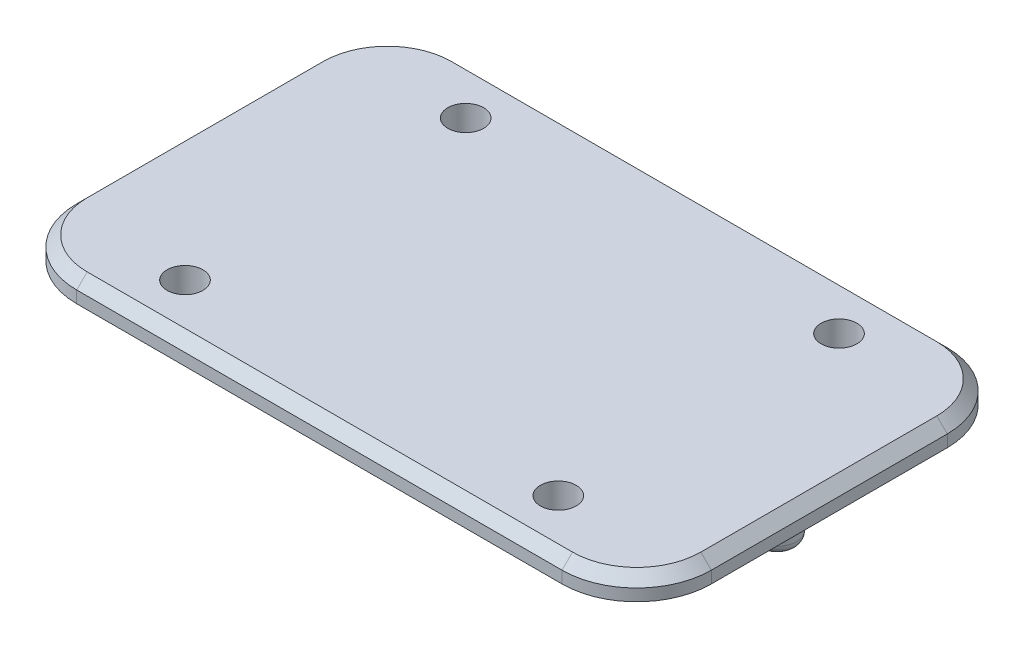
ISO-10303-21;
HEADER;
FILE_DESCRIPTION(('STEP AP214'),'2;1');
FILE_NAME('part.step','',(''),(''),'','','');
FILE_SCHEMA(('AUTOMOTIVE_DESIGN { 1 0 10303 214 1 1 1 1 }'));
ENDSEC;
DATA;
#1=APPLICATION_CONTEXT('core data for automotive mechanical design processes');
#2=APPLICATION_PROTOCOL_DEFINITION('international standard','automotive_design',2000,#1);
#3=PRODUCT_CONTEXT('',#1,'mechanical');
#4=PRODUCT('Part','Part','',(#3));
#5=PRODUCT_RELATED_PRODUCT_CATEGORY('part','',(#4));
#6=PRODUCT_DEFINITION_FORMATION('','',#4);
#7=PRODUCT_DEFINITION_CONTEXT('part definition',#1,'design');
#8=PRODUCT_DEFINITION('design','',#6,#7);
#9=PRODUCT_DEFINITION_SHAPE('','',#8);
#10=(LENGTH_UNIT() NAMED_UNIT(*) SI_UNIT(.MILLI.,.METRE.));
#11=(NAMED_UNIT(*) PLANE_ANGLE_UNIT() SI_UNIT($,.RADIAN.));
#12=(NAMED_UNIT(*) SI_UNIT($,.STERADIAN.) SOLID_ANGLE_UNIT());
#13=UNCERTAINTY_MEASURE_WITH_UNIT(LENGTH_MEASURE(1.E-05),#10,'distance_accuracy_value','');
#14=(GEOMETRIC_REPRESENTATION_CONTEXT(3) GLOBAL_UNCERTAINTY_ASSIGNED_CONTEXT((#13)) GLOBAL_UNIT_ASSIGNED_CONTEXT((#10,
#11,#12)) REPRESENTATION_CONTEXT('',''));
#15=CARTESIAN_POINT('',(0.,0.,0.));
#16=DIRECTION('',(0.,0.,1.));
#17=DIRECTION('',(1.,0.,0.));
#18=AXIS2_PLACEMENT_3D('',#15,#16,#17);
#19=CARTESIAN_POINT('',(21.25,1.5,-12.9));
#20=DIRECTION('',(0.,0.,1.));
#21=DIRECTION('',(1.,0.,0.));
#22=AXIS2_PLACEMENT_3D('',#19,#20,#21);
#23=PLANE('',#22);
#24=DIRECTION('',(0.,-1.,0.));
#25=VECTOR('',#24,1.);
#26=CARTESIAN_POINT('',(-16.25,1.5,-12.9));
#27=LINE('',#26,#25);
#28=CARTESIAN_POINT('',(-16.25,0.,-12.9));
#29=VERTEX_POINT('',#28);
#30=CARTESIAN_POINT('',(-16.25,0.800000000000001,-12.9));
#31=VERTEX_POINT('',#30);
#32=EDGE_CURVE('E337',#29,#31,#27,.F.);
#33=ORIENTED_EDGE('',*,*,#32,.T.);
#34=DIRECTION('',(1.,0.,0.));
#35=VECTOR('',#34,1.);
#36=CARTESIAN_POINT('',(16.25,0.800000000000001,-12.9));
#37=LINE('',#36,#35);
#38=CARTESIAN_POINT('',(16.25,0.800000000000001,-12.9));
#39=VERTEX_POINT('',#38);
#40=EDGE_CURVE('E371',#31,#39,#37,.T.);
#41=ORIENTED_EDGE('',*,*,#40,.T.);
#42=DIRECTION('',(0.,-1.,0.));
#43=VECTOR('',#42,1.);
#44=CARTESIAN_POINT('',(16.25,1.5,-12.9));
#45=LINE('',#44,#43);
#46=CARTESIAN_POINT('',(16.25,0.,-12.9));
#47=VERTEX_POINT('',#46);
#48=EDGE_CURVE('E340',#39,#47,#45,.T.);
#49=ORIENTED_EDGE('',*,*,#48,.T.);
#50=DIRECTION('',(-1.,0.,0.));
#51=VECTOR('',#50,1.);
#52=CARTESIAN_POINT('',(21.25,0.,-12.9));
#53=LINE('',#52,#51);
#54=EDGE_CURVE('E306',#47,#29,#53,.T.);
#55=ORIENTED_EDGE('',*,*,#54,.T.);
#56=EDGE_LOOP('',(#33,#41,#49,#55));
#57=FACE_BOUND('',#56,.T.);
#58=ADVANCED_FACE('F33',(#57),#23,.F.);
#59=CARTESIAN_POINT('',(-21.25,1.5,-12.9));
#60=DIRECTION('',(1.,0.,0.));
#61=DIRECTION('',(0.,0.,-1.));
#62=AXIS2_PLACEMENT_3D('',#59,#60,#61);
#63=PLANE('',#62);
#64=DIRECTION('',(0.,-1.,0.));
#65=VECTOR('',#64,1.);
#66=CARTESIAN_POINT('',(-21.25,1.5,7.9));
#67=LINE('',#66,#65);
#68=CARTESIAN_POINT('',(-21.25,0.,7.9));
#69=VERTEX_POINT('',#68);
#70=CARTESIAN_POINT('',(-21.25,0.800000000000001,7.9));
#71=VERTEX_POINT('',#70);
#72=EDGE_CURVE('E342',#69,#71,#67,.F.);
#73=ORIENTED_EDGE('',*,*,#72,.T.);
#74=DIRECTION('',(0.,0.,-1.));
#75=VECTOR('',#74,1.);
#76=CARTESIAN_POINT('',(-21.25,0.800000000000001,-7.9));
#77=LINE('',#76,#75);
#78=CARTESIAN_POINT('',(-21.25,0.800000000000001,-7.9));
#79=VERTEX_POINT('',#78);
#80=EDGE_CURVE('E379',#71,#79,#77,.T.);
#81=ORIENTED_EDGE('',*,*,#80,.T.);
#82=DIRECTION('',(0.,-1.,0.));
#83=VECTOR('',#82,1.);
#84=CARTESIAN_POINT('',(-21.25,1.5,-7.9));
#85=LINE('',#84,#83);
#86=CARTESIAN_POINT('',(-21.25,0.,-7.9));
#87=VERTEX_POINT('',#86);
#88=EDGE_CURVE('E345',#79,#87,#85,.T.);
#89=ORIENTED_EDGE('',*,*,#88,.T.);
#90=DIRECTION('',(0.,0.,1.));
#91=VECTOR('',#90,1.);
#92=CARTESIAN_POINT('',(-21.25,0.,-12.9));
#93=LINE('',#92,#91);
#94=EDGE_CURVE('E309',#87,#69,#93,.T.);
#95=ORIENTED_EDGE('',*,*,#94,.T.);
#96=EDGE_LOOP('',(#73,#81,#89,#95));
#97=FACE_BOUND('',#96,.T.);
#98=ADVANCED_FACE('F470',(#97),#63,.F.);
#99=CARTESIAN_POINT('',(21.25,1.5,12.9));
#100=DIRECTION('',(0.,0.,-1.));
#101=DIRECTION('',(-1.,0.,0.));
#102=AXIS2_PLACEMENT_3D('',#99,#100,#101);
#103=PLANE('',#102);
#104=DIRECTION('',(0.,-1.,0.));
#105=VECTOR('',#104,1.);
#106=CARTESIAN_POINT('',(16.25,1.5,12.9));
#107=LINE('',#106,#105);
#108=CARTESIAN_POINT('',(16.25,0.,12.9));
#109=VERTEX_POINT('',#108);
#110=CARTESIAN_POINT('',(16.25,0.800000000000001,12.9));
#111=VERTEX_POINT('',#110);
#112=EDGE_CURVE('E334',#109,#111,#107,.F.);
#113=ORIENTED_EDGE('',*,*,#112,.T.);
#114=DIRECTION('',(-1.,0.,0.));
#115=VECTOR('',#114,1.);
#116=CARTESIAN_POINT('',(-16.25,0.800000000000001,12.9));
#117=LINE('',#116,#115);
#118=CARTESIAN_POINT('',(-16.25,0.800000000000001,12.9));
#119=VERTEX_POINT('',#118);
#120=EDGE_CURVE('E373',#111,#119,#117,.T.);
#121=ORIENTED_EDGE('',*,*,#120,.T.);
#122=DIRECTION('',(0.,-1.,0.));
#123=VECTOR('',#122,1.);
#124=CARTESIAN_POINT('',(-16.25,1.5,12.9));
#125=LINE('',#124,#123);
#126=CARTESIAN_POINT('',(-16.25,0.,12.9));
#127=VERTEX_POINT('',#126);
#128=EDGE_CURVE('E332',#119,#127,#125,.T.);
#129=ORIENTED_EDGE('',*,*,#128,.T.);
#130=DIRECTION('',(1.,0.,0.));
#131=VECTOR('',#130,1.);
#132=CARTESIAN_POINT('',(21.25,0.,12.9));
#133=LINE('',#132,#131);
#134=EDGE_CURVE('E313',#127,#109,#133,.T.);
#135=ORIENTED_EDGE('',*,*,#134,.T.);
#136=EDGE_LOOP('',(#113,#121,#129,#135));
#137=FACE_BOUND('',#136,.T.);
#138=ADVANCED_FACE('F476',(#137),#103,.F.);
#139=CARTESIAN_POINT('',(21.25,1.5,-12.9));
#140=DIRECTION('',(-1.,0.,0.));
#141=DIRECTION('',(0.,0.,1.));
#142=AXIS2_PLACEMENT_3D('',#139,#140,#141);
#143=PLANE('',#142);
#144=DIRECTION('',(0.,-1.,0.));
#145=VECTOR('',#144,1.);
#146=CARTESIAN_POINT('',(21.25,1.5,-7.9));
#147=LINE('',#146,#145);
#148=CARTESIAN_POINT('',(21.25,0.,-7.9));
#149=VERTEX_POINT('',#148);
#150=CARTESIAN_POINT('',(21.25,0.800000000000001,-7.9));
#151=VERTEX_POINT('',#150);
#152=EDGE_CURVE('E319',#149,#151,#147,.F.);
#153=ORIENTED_EDGE('',*,*,#152,.T.);
#154=DIRECTION('',(0.,0.,1.));
#155=VECTOR('',#154,1.);
#156=CARTESIAN_POINT('',(21.25,0.800000000000001,7.89999999999999));
#157=LINE('',#156,#155);
#158=CARTESIAN_POINT('',(21.25,0.800000000000001,7.9));
#159=VERTEX_POINT('',#158);
#160=EDGE_CURVE('E364',#151,#159,#157,.T.);
#161=ORIENTED_EDGE('',*,*,#160,.T.);
#162=DIRECTION('',(0.,-1.,0.));
#163=VECTOR('',#162,1.);
#164=CARTESIAN_POINT('',(21.25,1.5,7.9));
#165=LINE('',#164,#163);
#166=CARTESIAN_POINT('',(21.25,0.,7.89999999999999));
#167=VERTEX_POINT('',#166);
#168=EDGE_CURVE('E322',#159,#167,#165,.T.);
#169=ORIENTED_EDGE('',*,*,#168,.T.);
#170=DIRECTION('',(0.,0.,-1.));
#171=VECTOR('',#170,1.);
#172=CARTESIAN_POINT('',(21.25,0.,-12.9));
#173=LINE('',#172,#171);
#174=EDGE_CURVE('E316',#167,#149,#173,.T.);
#175=ORIENTED_EDGE('',*,*,#174,.T.);
#176=EDGE_LOOP('',(#153,#161,#169,#175));
#177=FACE_BOUND('',#176,.T.);
#178=ADVANCED_FACE('F714',(#177),#143,.F.);
#179=CARTESIAN_POINT('',(0.,1.5,0.));
#180=DIRECTION('',(0.,1.,0.));
#181=DIRECTION('',(0.,0.,1.));
#182=AXIS2_PLACEMENT_3D('',#179,#180,#181);
#183=PLANE('',#182);
#184=CARTESIAN_POINT('',(-12.5,1.5,-9.4));
#185=DIRECTION('',(0.,-1.,0.));
#186=DIRECTION('',(0.,0.,-1.));
#187=AXIS2_PLACEMENT_3D('',#184,#185,#186);
#188=CIRCLE('',#187,1.2);
#189=CARTESIAN_POINT('',(-12.5,1.5,-10.6));
#190=VERTEX_POINT('',#189);
#191=EDGE_CURVE('E670',#190,#190,#188,.T.);
#192=ORIENTED_EDGE('',*,*,#191,.T.);
#193=EDGE_LOOP('',(#192));
#194=FACE_BOUND('',#193,.T.);
#195=CARTESIAN_POINT('',(12.5,1.5,-9.4));
#196=DIRECTION('',(0.,-1.,0.));
#197=DIRECTION('',(0.,0.,-1.));
#198=AXIS2_PLACEMENT_3D('',#195,#196,#197);
#199=CIRCLE('',#198,1.2);
#200=CARTESIAN_POINT('',(12.5,1.5,-10.6));
#201=VERTEX_POINT('',#200);
#202=EDGE_CURVE('E691',#201,#201,#199,.T.);
#203=ORIENTED_EDGE('',*,*,#202,.T.);
#204=EDGE_LOOP('',(#203));
#205=FACE_BOUND('',#204,.T.);
#206=CARTESIAN_POINT('',(12.5,1.5,9.4));
#207=DIRECTION('',(0.,-1.,0.));
#208=DIRECTION('',(0.,0.,-1.));
#209=AXIS2_PLACEMENT_3D('',#206,#207,#208);
#210=CIRCLE('',#209,1.2);
#211=CARTESIAN_POINT('',(12.5,1.5,8.2));
#212=VERTEX_POINT('',#211);
#213=EDGE_CURVE('E682',#212,#212,#210,.T.);
#214=ORIENTED_EDGE('',*,*,#213,.T.);
#215=EDGE_LOOP('',(#214));
#216=FACE_BOUND('',#215,.T.);
#217=CARTESIAN_POINT('',(-12.5,1.5,9.39999999999999));
#218=DIRECTION('',(0.,-1.,0.));
#219=DIRECTION('',(0.,0.,-1.));
#220=AXIS2_PLACEMENT_3D('',#217,#218,#219);
#221=CIRCLE('',#220,1.2);
#222=CARTESIAN_POINT('',(-12.5,1.5,8.19999999999999));
#223=VERTEX_POINT('',#222);
#224=EDGE_CURVE('E419',#223,#223,#221,.T.);
#225=ORIENTED_EDGE('',*,*,#224,.T.);
#226=EDGE_LOOP('',(#225));
#227=FACE_BOUND('',#226,.T.);
#228=CARTESIAN_POINT('',(16.25,1.5,7.9));
#229=DIRECTION('',(0.,1.,0.));
#230=DIRECTION('',(0.,0.,1.));
#231=AXIS2_PLACEMENT_3D('',#228,#229,#230);
#232=CIRCLE('',#231,4.30000000000001);
#233=CARTESIAN_POINT('',(16.25,1.5,12.2));
#234=VERTEX_POINT('',#233);
#235=CARTESIAN_POINT('',(20.55,1.5,7.9));
#236=VERTEX_POINT('',#235);
#237=EDGE_CURVE('E357',#234,#236,#232,.T.);
#238=ORIENTED_EDGE('',*,*,#237,.T.);
#239=DIRECTION('',(0.,0.,-1.));
#240=VECTOR('',#239,1.);
#241=CARTESIAN_POINT('',(20.55,1.5,-7.9));
#242=LINE('',#241,#240);
#243=CARTESIAN_POINT('',(20.55,1.5,-7.9));
#244=VERTEX_POINT('',#243);
#245=EDGE_CURVE('E361',#236,#244,#242,.T.);
#246=ORIENTED_EDGE('',*,*,#245,.T.);
#247=CARTESIAN_POINT('',(16.25,1.5,-7.9));
#248=DIRECTION('',(0.,1.,0.));
#249=DIRECTION('',(0.,0.,1.));
#250=AXIS2_PLACEMENT_3D('',#247,#248,#249);
#251=CIRCLE('',#250,4.30000000000001);
#252=CARTESIAN_POINT('',(16.25,1.5,-12.2));
#253=VERTEX_POINT('',#252);
#254=EDGE_CURVE('E359',#244,#253,#251,.T.);
#255=ORIENTED_EDGE('',*,*,#254,.T.);
#256=DIRECTION('',(-1.,0.,0.));
#257=VECTOR('',#256,1.);
#258=CARTESIAN_POINT('',(-16.25,1.5,-12.2));
#259=LINE('',#258,#257);
#260=CARTESIAN_POINT('',(-16.25,1.5,-12.2));
#261=VERTEX_POINT('',#260);
#262=EDGE_CURVE('E355',#253,#261,#259,.T.);
#263=ORIENTED_EDGE('',*,*,#262,.T.);
#264=CARTESIAN_POINT('',(-16.25,1.5,-7.9));
#265=DIRECTION('',(0.,1.,0.));
#266=DIRECTION('',(0.,0.,1.));
#267=AXIS2_PLACEMENT_3D('',#264,#265,#266);
#268=CIRCLE('',#267,4.30000000000001);
#269=CARTESIAN_POINT('',(-20.55,1.5,-7.9));
#270=VERTEX_POINT('',#269);
#271=EDGE_CURVE('E351',#261,#270,#268,.T.);
#272=ORIENTED_EDGE('',*,*,#271,.T.);
#273=DIRECTION('',(0.,0.,1.));
#274=VECTOR('',#273,1.);
#275=CARTESIAN_POINT('',(-20.55,1.5,7.9));
#276=LINE('',#275,#274);
#277=CARTESIAN_POINT('',(-20.55,1.5,7.9));
#278=VERTEX_POINT('',#277);
#279=EDGE_CURVE('E347',#270,#278,#276,.T.);
#280=ORIENTED_EDGE('',*,*,#279,.T.);
#281=CARTESIAN_POINT('',(-16.25,1.5,7.9));
#282=DIRECTION('',(0.,1.,0.));
#283=DIRECTION('',(0.,0.,1.));
#284=AXIS2_PLACEMENT_3D('',#281,#282,#283);
#285=CIRCLE('',#284,4.30000000000001);
#286=CARTESIAN_POINT('',(-16.25,1.5,12.2));
#287=VERTEX_POINT('',#286);
#288=EDGE_CURVE('E349',#278,#287,#285,.T.);
#289=ORIENTED_EDGE('',*,*,#288,.T.);
#290=DIRECTION('',(1.,0.,0.));
#291=VECTOR('',#290,1.);
#292=CARTESIAN_POINT('',(16.25,1.5,12.2));
#293=LINE('',#292,#291);
#294=EDGE_CURVE('E353',#287,#234,#293,.T.);
#295=ORIENTED_EDGE('',*,*,#294,.T.);
#296=EDGE_LOOP('',(#238,#246,#255,#263,#272,#280,#289,#295));
#297=FACE_BOUND('',#296,.T.);
#298=ADVANCED_FACE('F709',(#194,#205,#216,#227,#297),#183,.T.);
#299=CARTESIAN_POINT('',(0.,0.,0.));
#300=DIRECTION('',(0.,1.,0.));
#301=DIRECTION('',(0.,0.,1.));
#302=AXIS2_PLACEMENT_3D('',#299,#300,#301);
#303=PLANE('',#302);
#304=DIRECTION('',(1.,0.,0.));
#305=VECTOR('',#304,1.);
#306=CARTESIAN_POINT('',(-12.5,0.,10.7));
#307=LINE('',#306,#305);
#308=CARTESIAN_POINT('',(-12.5,0.,10.7));
#309=VERTEX_POINT('',#308);
#310=CARTESIAN_POINT('',(12.5,0.,10.7));
#311=VERTEX_POINT('',#310);
#312=EDGE_CURVE('E232',#309,#311,#307,.T.);
#313=ORIENTED_EDGE('',*,*,#312,.T.);
#314=CARTESIAN_POINT('',(12.5,0.,9.4));
#315=DIRECTION('',(0.,1.,0.));
#316=DIRECTION('',(0.,0.,1.));
#317=AXIS2_PLACEMENT_3D('',#314,#315,#316);
#318=CIRCLE('',#317,1.3);
#319=CARTESIAN_POINT('',(12.5,0.,8.1));
#320=VERTEX_POINT('',#319);
#321=EDGE_CURVE('E243',#311,#320,#318,.T.);
#322=ORIENTED_EDGE('',*,*,#321,.T.);
#323=DIRECTION('',(-1.,0.,0.));
#324=VECTOR('',#323,1.);
#325=CARTESIAN_POINT('',(12.5,0.,8.1));
#326=LINE('',#325,#324);
#327=CARTESIAN_POINT('',(-12.5,0.,8.1));
#328=VERTEX_POINT('',#327);
#329=EDGE_CURVE('E212',#320,#328,#326,.T.);
#330=ORIENTED_EDGE('',*,*,#329,.T.);
#331=CARTESIAN_POINT('',(-12.5,0.,9.4));
#332=DIRECTION('',(0.,1.,0.));
#333=DIRECTION('',(0.,0.,1.));
#334=AXIS2_PLACEMENT_3D('',#331,#332,#333);
#335=CIRCLE('',#334,1.3);
#336=EDGE_CURVE('E235',#328,#309,#335,.T.);
#337=ORIENTED_EDGE('',*,*,#336,.T.);
#338=EDGE_LOOP('',(#313,#322,#330,#337));
#339=FACE_BOUND('',#338,.T.);
#340=DIRECTION('',(1.,0.,0.));
#341=VECTOR('',#340,1.);
#342=CARTESIAN_POINT('',(-12.5,0.,-8.1));
#343=LINE('',#342,#341);
#344=CARTESIAN_POINT('',(-12.5,0.,-8.1));
#345=VERTEX_POINT('',#344);
#346=CARTESIAN_POINT('',(12.5,0.,-8.10000000000001));
#347=VERTEX_POINT('',#346);
#348=EDGE_CURVE('E257',#345,#347,#343,.T.);
#349=ORIENTED_EDGE('',*,*,#348,.T.);
#350=CARTESIAN_POINT('',(12.5,0.,-9.40000000000001));
#351=DIRECTION('',(0.,1.,0.));
#352=DIRECTION('',(0.,0.,1.));
#353=AXIS2_PLACEMENT_3D('',#350,#351,#352);
#354=CIRCLE('',#353,1.3);
#355=CARTESIAN_POINT('',(12.5,0.,-10.7));
#356=VERTEX_POINT('',#355);
#357=EDGE_CURVE('E249',#347,#356,#354,.T.);
#358=ORIENTED_EDGE('',*,*,#357,.T.);
#359=DIRECTION('',(-1.,0.,0.));
#360=VECTOR('',#359,1.);
#361=CARTESIAN_POINT('',(12.5,0.,-10.7));
#362=LINE('',#361,#360);
#363=CARTESIAN_POINT('',(-12.5,0.,-10.7));
#364=VERTEX_POINT('',#363);
#365=EDGE_CURVE('E269',#356,#364,#362,.T.);
#366=ORIENTED_EDGE('',*,*,#365,.T.);
#367=CARTESIAN_POINT('',(-12.5,0.,-9.4));
#368=DIRECTION('',(0.,1.,0.));
#369=DIRECTION('',(0.,0.,1.));
#370=AXIS2_PLACEMENT_3D('',#367,#368,#369);
#371=CIRCLE('',#370,1.3);
#372=EDGE_CURVE('E272',#364,#345,#371,.T.);
#373=ORIENTED_EDGE('',*,*,#372,.T.);
#374=EDGE_LOOP('',(#349,#358,#366,#373));
#375=FACE_BOUND('',#374,.T.);
#376=DIRECTION('',(1.,0.,0.));
#377=VECTOR('',#376,1.);
#378=CARTESIAN_POINT('',(-17.75,0.,1.3));
#379=LINE('',#378,#377);
#380=CARTESIAN_POINT('',(-17.75,0.,1.3));
#381=VERTEX_POINT('',#380);
#382=CARTESIAN_POINT('',(17.75,0.,1.29999999999999));
#383=VERTEX_POINT('',#382);
#384=EDGE_CURVE('E294',#381,#383,#379,.T.);
#385=ORIENTED_EDGE('',*,*,#384,.T.);
#386=CARTESIAN_POINT('',(17.75,0.,0.));
#387=DIRECTION('',(0.,1.,0.));
#388=DIRECTION('',(0.,0.,1.));
#389=AXIS2_PLACEMENT_3D('',#386,#387,#388);
#390=CIRCLE('',#389,1.3);
#391=CARTESIAN_POINT('',(17.75,0.,-1.3));
#392=VERTEX_POINT('',#391);
#393=EDGE_CURVE('E279',#383,#392,#390,.T.);
#394=ORIENTED_EDGE('',*,*,#393,.T.);
#395=DIRECTION('',(-1.,0.,0.));
#396=VECTOR('',#395,1.);
#397=CARTESIAN_POINT('',(17.75,0.,-1.3));
#398=LINE('',#397,#396);
#399=CARTESIAN_POINT('',(-17.75,0.,-1.3));
#400=VERTEX_POINT('',#399);
#401=EDGE_CURVE('E288',#392,#400,#398,.T.);
#402=ORIENTED_EDGE('',*,*,#401,.T.);
#403=CARTESIAN_POINT('',(-17.75,0.,0.));
#404=DIRECTION('',(0.,1.,0.));
#405=DIRECTION('',(0.,0.,1.));
#406=AXIS2_PLACEMENT_3D('',#403,#404,#405);
#407=CIRCLE('',#406,1.3);
#408=EDGE_CURVE('E291',#400,#381,#407,.T.);
#409=ORIENTED_EDGE('',*,*,#408,.T.);
#410=EDGE_LOOP('',(#385,#394,#402,#409));
#411=FACE_BOUND('',#410,.T.);
#412=ORIENTED_EDGE('',*,*,#174,.F.);
#413=CARTESIAN_POINT('',(16.25,0.,7.9));
#414=DIRECTION('',(0.,1.,0.));
#415=DIRECTION('',(0.,0.,1.));
#416=AXIS2_PLACEMENT_3D('',#413,#414,#415);
#417=CIRCLE('',#416,5.);
#418=EDGE_CURVE('E330',#167,#109,#417,.F.);
#419=ORIENTED_EDGE('',*,*,#418,.T.);
#420=ORIENTED_EDGE('',*,*,#134,.F.);
#421=CARTESIAN_POINT('',(-16.25,0.,7.9));
#422=DIRECTION('',(0.,1.,0.));
#423=DIRECTION('',(0.,0.,1.));
#424=AXIS2_PLACEMENT_3D('',#421,#422,#423);
#425=CIRCLE('',#424,5.);
#426=EDGE_CURVE('E324',#127,#69,#425,.F.);
#427=ORIENTED_EDGE('',*,*,#426,.T.);
#428=ORIENTED_EDGE('',*,*,#94,.F.);
#429=CARTESIAN_POINT('',(-16.25,0.,-7.9));
#430=DIRECTION('',(0.,1.,0.));
#431=DIRECTION('',(0.,0.,1.));
#432=AXIS2_PLACEMENT_3D('',#429,#430,#431);
#433=CIRCLE('',#432,5.);
#434=EDGE_CURVE('E326',#87,#29,#433,.F.);
#435=ORIENTED_EDGE('',*,*,#434,.T.);
#436=ORIENTED_EDGE('',*,*,#54,.F.);
#437=CARTESIAN_POINT('',(16.25,0.,-7.9));
#438=DIRECTION('',(0.,1.,0.));
#439=DIRECTION('',(0.,0.,1.));
#440=AXIS2_PLACEMENT_3D('',#437,#438,#439);
#441=CIRCLE('',#440,5.);
#442=EDGE_CURVE('E328',#47,#149,#441,.F.);
#443=ORIENTED_EDGE('',*,*,#442,.T.);
#444=EDGE_LOOP('',(#412,#419,#420,#427,#428,#435,#436,#443));
#445=FACE_BOUND('',#444,.T.);
#446=ADVANCED_FACE('F450',(#339,#375,#411,#445),#303,.F.);
#447=CARTESIAN_POINT('',(16.25,1.5,7.9));
#448=DIRECTION('',(0.,-1.,0.));
#449=DIRECTION('',(0.,0.,-1.));
#450=AXIS2_PLACEMENT_3D('',#447,#448,#449);
#451=CYLINDRICAL_SURFACE('',#450,5.);
#452=ORIENTED_EDGE('',*,*,#168,.F.);
#453=CARTESIAN_POINT('',(16.25,0.800000000000001,7.9));
#454=DIRECTION('',(0.,1.,0.));
#455=DIRECTION('',(0.,0.,1.));
#456=AXIS2_PLACEMENT_3D('',#453,#454,#455);
#457=CIRCLE('',#456,5.);
#458=EDGE_CURVE('E369',#159,#111,#457,.F.);
#459=ORIENTED_EDGE('',*,*,#458,.T.);
#460=ORIENTED_EDGE('',*,*,#112,.F.);
#461=ORIENTED_EDGE('',*,*,#418,.F.);
#462=EDGE_LOOP('',(#452,#459,#460,#461));
#463=FACE_BOUND('',#462,.T.);
#464=ADVANCED_FACE('F481',(#463),#451,.T.);
#465=CARTESIAN_POINT('',(16.25,1.5,-7.9));
#466=DIRECTION('',(0.,-1.,0.));
#467=DIRECTION('',(0.,0.,-1.));
#468=AXIS2_PLACEMENT_3D('',#465,#466,#467);
#469=CYLINDRICAL_SURFACE('',#468,5.);
#470=ORIENTED_EDGE('',*,*,#48,.F.);
#471=CARTESIAN_POINT('',(16.25,0.800000000000001,-7.9));
#472=DIRECTION('',(0.,1.,0.));
#473=DIRECTION('',(0.,0.,1.));
#474=AXIS2_PLACEMENT_3D('',#471,#472,#473);
#475=CIRCLE('',#474,5.);
#476=EDGE_CURVE('E367',#39,#151,#475,.F.);
#477=ORIENTED_EDGE('',*,*,#476,.T.);
#478=ORIENTED_EDGE('',*,*,#152,.F.);
#479=ORIENTED_EDGE('',*,*,#442,.F.);
#480=EDGE_LOOP('',(#470,#477,#478,#479));
#481=FACE_BOUND('',#480,.T.);
#482=ADVANCED_FACE('F484',(#481),#469,.T.);
#483=CARTESIAN_POINT('',(-16.25,1.5,-7.9));
#484=DIRECTION('',(0.,-1.,0.));
#485=DIRECTION('',(0.,0.,-1.));
#486=AXIS2_PLACEMENT_3D('',#483,#484,#485);
#487=CYLINDRICAL_SURFACE('',#486,5.);
#488=ORIENTED_EDGE('',*,*,#88,.F.);
#489=CARTESIAN_POINT('',(-16.25,0.800000000000001,-7.9));
#490=DIRECTION('',(0.,1.,0.));
#491=DIRECTION('',(0.,0.,1.));
#492=AXIS2_PLACEMENT_3D('',#489,#490,#491);
#493=CIRCLE('',#492,5.);
#494=EDGE_CURVE('E375',#79,#31,#493,.F.);
#495=ORIENTED_EDGE('',*,*,#494,.T.);
#496=ORIENTED_EDGE('',*,*,#32,.F.);
#497=ORIENTED_EDGE('',*,*,#434,.F.);
#498=EDGE_LOOP('',(#488,#495,#496,#497));
#499=FACE_BOUND('',#498,.T.);
#500=ADVANCED_FACE('F488',(#499),#487,.T.);
#501=CARTESIAN_POINT('',(-16.25,1.5,7.9));
#502=DIRECTION('',(0.,-1.,0.));
#503=DIRECTION('',(0.,0.,-1.));
#504=AXIS2_PLACEMENT_3D('',#501,#502,#503);
#505=CYLINDRICAL_SURFACE('',#504,5.);
#506=ORIENTED_EDGE('',*,*,#128,.F.);
#507=CARTESIAN_POINT('',(-16.25,0.800000000000001,7.9));
#508=DIRECTION('',(0.,1.,0.));
#509=DIRECTION('',(0.,0.,1.));
#510=AXIS2_PLACEMENT_3D('',#507,#508,#509);
#511=CIRCLE('',#510,5.);
#512=EDGE_CURVE('E377',#119,#71,#511,.F.);
#513=ORIENTED_EDGE('',*,*,#512,.T.);
#514=ORIENTED_EDGE('',*,*,#72,.F.);
#515=ORIENTED_EDGE('',*,*,#426,.F.);
#516=EDGE_LOOP('',(#506,#513,#514,#515));
#517=FACE_BOUND('',#516,.T.);
#518=ADVANCED_FACE('F492',(#517),#505,.T.);
#519=CARTESIAN_POINT('',(-20.55,1.5,0.));
#520=DIRECTION('',(-0.707106781186551,0.707106781186544,0.));
#521=DIRECTION('',(0.,0.,-1.));
#522=AXIS2_PLACEMENT_3D('',#519,#520,#521);
#523=PLANE('',#522);
#524=DIRECTION('',(0.707106781186544,0.707106781186551,0.));
#525=VECTOR('',#524,1.);
#526=CARTESIAN_POINT('',(-21.25,0.800000000000001,-7.9));
#527=LINE('',#526,#525);
#528=EDGE_CURVE('E397',#79,#270,#527,.T.);
#529=ORIENTED_EDGE('',*,*,#528,.F.);
#530=ORIENTED_EDGE('',*,*,#80,.F.);
#531=DIRECTION('',(-0.707106781186544,-0.707106781186551,0.));
#532=VECTOR('',#531,1.);
#533=CARTESIAN_POINT('',(-20.55,1.5,7.9));
#534=LINE('',#533,#532);
#535=EDGE_CURVE('E310',#278,#71,#534,.T.);
#536=ORIENTED_EDGE('',*,*,#535,.F.);
#537=ORIENTED_EDGE('',*,*,#279,.F.);
#538=EDGE_LOOP('',(#529,#530,#536,#537));
#539=FACE_BOUND('',#538,.T.);
#540=ADVANCED_FACE('F495',(#539),#523,.T.);
#541=CARTESIAN_POINT('',(-16.25,1.5,7.9));
#542=DIRECTION('',(0.,-1.,0.));
#543=DIRECTION('',(0.,0.,-1.));
#544=AXIS2_PLACEMENT_3D('',#541,#542,#543);
#545=CONICAL_SURFACE('',#544,4.30000000000001,0.785398163397443);
#546=ORIENTED_EDGE('',*,*,#535,.T.);
#547=ORIENTED_EDGE('',*,*,#512,.F.);
#548=DIRECTION('',(0.,-0.707106781186552,0.707106781186543));
#549=VECTOR('',#548,1.);
#550=CARTESIAN_POINT('',(-16.25,1.5,12.2));
#551=LINE('',#550,#549);
#552=EDGE_CURVE('E394',#287,#119,#551,.T.);
#553=ORIENTED_EDGE('',*,*,#552,.F.);
#554=ORIENTED_EDGE('',*,*,#288,.F.);
#555=EDGE_LOOP('',(#546,#547,#553,#554));
#556=FACE_BOUND('',#555,.T.);
#557=ADVANCED_FACE('F516',(#556),#545,.T.);
#558=CARTESIAN_POINT('',(-16.25,1.5,-7.9));
#559=DIRECTION('',(0.,-1.,0.));
#560=DIRECTION('',(0.,0.,-1.));
#561=AXIS2_PLACEMENT_3D('',#558,#559,#560);
#562=CONICAL_SURFACE('',#561,4.30000000000001,0.785398163397444);
#563=ORIENTED_EDGE('',*,*,#528,.T.);
#564=ORIENTED_EDGE('',*,*,#271,.F.);
#565=DIRECTION('',(0.,0.707106781186551,0.707106781186544));
#566=VECTOR('',#565,1.);
#567=CARTESIAN_POINT('',(-16.25,0.800000000000001,-12.9));
#568=LINE('',#567,#566);
#569=EDGE_CURVE('E391',#31,#261,#568,.T.);
#570=ORIENTED_EDGE('',*,*,#569,.F.);
#571=ORIENTED_EDGE('',*,*,#494,.F.);
#572=EDGE_LOOP('',(#563,#564,#570,#571));
#573=FACE_BOUND('',#572,.T.);
#574=ADVANCED_FACE('F512',(#573),#562,.T.);
#575=CARTESIAN_POINT('',(0.,1.5,12.2));
#576=DIRECTION('',(0.,0.707106781186544,0.707106781186551));
#577=DIRECTION('',(-1.,0.,0.));
#578=AXIS2_PLACEMENT_3D('',#575,#576,#577);
#579=PLANE('',#578);
#580=ORIENTED_EDGE('',*,*,#552,.T.);
#581=ORIENTED_EDGE('',*,*,#120,.F.);
#582=DIRECTION('',(0.,-0.70710678118655,0.707106781186545));
#583=VECTOR('',#582,1.);
#584=CARTESIAN_POINT('',(16.25,1.5,12.2));
#585=LINE('',#584,#583);
#586=EDGE_CURVE('E388',#234,#111,#585,.T.);
#587=ORIENTED_EDGE('',*,*,#586,.F.);
#588=ORIENTED_EDGE('',*,*,#294,.F.);
#589=EDGE_LOOP('',(#580,#581,#587,#588));
#590=FACE_BOUND('',#589,.T.);
#591=ADVANCED_FACE('F508',(#590),#579,.T.);
#592=CARTESIAN_POINT('',(0.,1.5,-12.2));
#593=DIRECTION('',(0.,0.707106781186544,-0.707106781186551));
#594=DIRECTION('',(1.,0.,0.));
#595=AXIS2_PLACEMENT_3D('',#592,#593,#594);
#596=PLANE('',#595);
#597=ORIENTED_EDGE('',*,*,#569,.T.);
#598=ORIENTED_EDGE('',*,*,#262,.F.);
#599=DIRECTION('',(0.,0.707106781186551,0.707106781186544));
#600=VECTOR('',#599,1.);
#601=CARTESIAN_POINT('',(16.25,0.800000000000001,-12.9));
#602=LINE('',#601,#600);
#603=EDGE_CURVE('E385',#39,#253,#602,.T.);
#604=ORIENTED_EDGE('',*,*,#603,.F.);
#605=ORIENTED_EDGE('',*,*,#40,.F.);
#606=EDGE_LOOP('',(#597,#598,#604,#605));
#607=FACE_BOUND('',#606,.T.);
#608=ADVANCED_FACE('F504',(#607),#596,.T.);
#609=CARTESIAN_POINT('',(16.25,1.5,7.9));
#610=DIRECTION('',(0.,-1.,0.));
#611=DIRECTION('',(0.,0.,-1.));
#612=AXIS2_PLACEMENT_3D('',#609,#610,#611);
#613=CONICAL_SURFACE('',#612,4.30000000000001,0.785398163397443);
#614=ORIENTED_EDGE('',*,*,#586,.T.);
#615=ORIENTED_EDGE('',*,*,#458,.F.);
#616=DIRECTION('',(0.707106781186544,-0.707106781186551,0.));
#617=VECTOR('',#616,1.);
#618=CARTESIAN_POINT('',(20.55,1.5,7.9));
#619=LINE('',#618,#617);
#620=EDGE_CURVE('E383',#236,#159,#619,.T.);
#621=ORIENTED_EDGE('',*,*,#620,.F.);
#622=ORIENTED_EDGE('',*,*,#237,.F.);
#623=EDGE_LOOP('',(#614,#615,#621,#622));
#624=FACE_BOUND('',#623,.T.);
#625=ADVANCED_FACE('F500',(#624),#613,.T.);
#626=CARTESIAN_POINT('',(16.25,1.5,-7.9));
#627=DIRECTION('',(0.,-1.,0.));
#628=DIRECTION('',(0.,0.,-1.));
#629=AXIS2_PLACEMENT_3D('',#626,#627,#628);
#630=CONICAL_SURFACE('',#629,4.30000000000001,0.785398163397443);
#631=ORIENTED_EDGE('',*,*,#603,.T.);
#632=ORIENTED_EDGE('',*,*,#254,.F.);
#633=DIRECTION('',(-0.707106781186544,0.707106781186551,0.));
#634=VECTOR('',#633,1.);
#635=CARTESIAN_POINT('',(21.25,0.800000000000001,-7.9));
#636=LINE('',#635,#634);
#637=EDGE_CURVE('E300',#151,#244,#636,.T.);
#638=ORIENTED_EDGE('',*,*,#637,.F.);
#639=ORIENTED_EDGE('',*,*,#476,.F.);
#640=EDGE_LOOP('',(#631,#632,#638,#639));
#641=FACE_BOUND('',#640,.T.);
#642=ADVANCED_FACE('F464',(#641),#630,.T.);
#643=CARTESIAN_POINT('',(20.55,1.5,0.));
#644=DIRECTION('',(0.707106781186551,0.707106781186544,0.));
#645=DIRECTION('',(0.,0.,1.));
#646=AXIS2_PLACEMENT_3D('',#643,#644,#645);
#647=PLANE('',#646);
#648=ORIENTED_EDGE('',*,*,#620,.T.);
#649=ORIENTED_EDGE('',*,*,#160,.F.);
#650=ORIENTED_EDGE('',*,*,#637,.T.);
#651=ORIENTED_EDGE('',*,*,#245,.F.);
#652=EDGE_LOOP('',(#648,#649,#650,#651));
#653=FACE_BOUND('',#652,.T.);
#654=ADVANCED_FACE('F457',(#653),#647,.T.);
#655=CARTESIAN_POINT('',(17.75,-1.5,0.));
#656=DIRECTION('',(0.,1.,0.));
#657=DIRECTION('',(0.,0.,1.));
#658=AXIS2_PLACEMENT_3D('',#655,#656,#657);
#659=CYLINDRICAL_SURFACE('',#658,1.3);
#660=DIRECTION('',(0.,1.,0.));
#661=VECTOR('',#660,1.);
#662=CARTESIAN_POINT('',(17.75,-1.5,1.29999999999999));
#663=LINE('',#662,#661);
#664=CARTESIAN_POINT('',(17.75,-2.6,1.29999999999999));
#665=VERTEX_POINT('',#664);
#666=EDGE_CURVE('E298',#665,#383,#663,.T.);
#667=ORIENTED_EDGE('',*,*,#666,.F.);
#668=CARTESIAN_POINT('',(17.75,-2.6,0.));
#669=DIRECTION('',(0.,1.,0.));
#670=DIRECTION('',(0.,0.,1.));
#671=AXIS2_PLACEMENT_3D('',#668,#669,#670);
#672=CIRCLE('',#671,1.3);
#673=CARTESIAN_POINT('',(17.75,-2.6,-1.3));
#674=VERTEX_POINT('',#673);
#675=EDGE_CURVE('E42',#665,#674,#672,.T.);
#676=ORIENTED_EDGE('',*,*,#675,.T.);
#677=DIRECTION('',(0.,1.,0.));
#678=VECTOR('',#677,1.);
#679=CARTESIAN_POINT('',(17.75,-1.5,-1.3));
#680=LINE('',#679,#678);
#681=EDGE_CURVE('E297',#674,#392,#680,.T.);
#682=ORIENTED_EDGE('',*,*,#681,.T.);
#683=ORIENTED_EDGE('',*,*,#393,.F.);
#684=EDGE_LOOP('',(#667,#676,#682,#683));
#685=FACE_BOUND('',#684,.T.);
#686=ADVANCED_FACE('F455',(#685),#659,.T.);
#687=CARTESIAN_POINT('',(-17.75,-1.5,1.3));
#688=DIRECTION('',(0.,0.,1.));
#689=DIRECTION('',(1.,0.,0.));
#690=AXIS2_PLACEMENT_3D('',#687,#688,#689);
#691=PLANE('',#690);
#692=DIRECTION('',(0.,1.,0.));
#693=VECTOR('',#692,1.);
#694=CARTESIAN_POINT('',(-17.75,-1.5,1.3));
#695=LINE('',#694,#693);
#696=CARTESIAN_POINT('',(-17.75,-2.6,1.3));
#697=VERTEX_POINT('',#696);
#698=EDGE_CURVE('E301',#697,#381,#695,.T.);
#699=ORIENTED_EDGE('',*,*,#698,.F.);
#700=DIRECTION('',(1.,0.,0.));
#701=VECTOR('',#700,1.);
#702=CARTESIAN_POINT('',(17.75,-2.6,1.29999999999999));
#703=LINE('',#702,#701);
#704=EDGE_CURVE('E12',#697,#665,#703,.T.);
#705=ORIENTED_EDGE('',*,*,#704,.T.);
#706=ORIENTED_EDGE('',*,*,#666,.T.);
#707=ORIENTED_EDGE('',*,*,#384,.F.);
#708=EDGE_LOOP('',(#699,#705,#706,#707));
#709=FACE_BOUND('',#708,.T.);
#710=ADVANCED_FACE('F447',(#709),#691,.T.);
#711=CARTESIAN_POINT('',(-17.75,-1.5,0.));
#712=DIRECTION('',(0.,1.,0.));
#713=DIRECTION('',(0.,0.,1.));
#714=AXIS2_PLACEMENT_3D('',#711,#712,#713);
#715=CYLINDRICAL_SURFACE('',#714,1.3);
#716=DIRECTION('',(0.,1.,0.));
#717=VECTOR('',#716,1.);
#718=CARTESIAN_POINT('',(-17.75,-1.5,-1.3));
#719=LINE('',#718,#717);
#720=CARTESIAN_POINT('',(-17.75,-2.6,-1.3));
#721=VERTEX_POINT('',#720);
#722=EDGE_CURVE('E303',#721,#400,#719,.T.);
#723=ORIENTED_EDGE('',*,*,#722,.F.);
#724=CARTESIAN_POINT('',(-17.75,-2.6,0.));
#725=DIRECTION('',(0.,1.,0.));
#726=DIRECTION('',(0.,0.,1.));
#727=AXIS2_PLACEMENT_3D('',#724,#725,#726);
#728=CIRCLE('',#727,1.3);
#729=EDGE_CURVE('E381',#721,#697,#728,.T.);
#730=ORIENTED_EDGE('',*,*,#729,.T.);
#731=ORIENTED_EDGE('',*,*,#698,.T.);
#732=ORIENTED_EDGE('',*,*,#408,.F.);
#733=EDGE_LOOP('',(#723,#730,#731,#732));
#734=FACE_BOUND('',#733,.T.);
#735=ADVANCED_FACE('F444',(#734),#715,.T.);
#736=CARTESIAN_POINT('',(17.75,-1.5,-1.3));
#737=DIRECTION('',(0.,0.,-1.));
#738=DIRECTION('',(-1.,0.,0.));
#739=AXIS2_PLACEMENT_3D('',#736,#737,#738);
#740=PLANE('',#739);
#741=ORIENTED_EDGE('',*,*,#681,.F.);
#742=DIRECTION('',(-1.,0.,0.));
#743=VECTOR('',#742,1.);
#744=CARTESIAN_POINT('',(-17.75,-2.6,-1.3));
#745=LINE('',#744,#743);
#746=EDGE_CURVE('E413',#674,#721,#745,.T.);
#747=ORIENTED_EDGE('',*,*,#746,.T.);
#748=ORIENTED_EDGE('',*,*,#722,.T.);
#749=ORIENTED_EDGE('',*,*,#401,.F.);
#750=EDGE_LOOP('',(#741,#747,#748,#749));
#751=FACE_BOUND('',#750,.T.);
#752=ADVANCED_FACE('F454',(#751),#740,.T.);
#753=CARTESIAN_POINT('',(12.5,-1.5,-9.40000000000001));
#754=DIRECTION('',(0.,1.,0.));
#755=DIRECTION('',(0.,0.,1.));
#756=AXIS2_PLACEMENT_3D('',#753,#754,#755);
#757=CYLINDRICAL_SURFACE('',#756,1.3);
#758=ORIENTED_EDGE('',*,*,#357,.F.);
#759=DIRECTION('',(0.,1.,0.));
#760=VECTOR('',#759,1.);
#761=CARTESIAN_POINT('',(12.5,-1.5,-8.10000000000001));
#762=LINE('',#761,#760);
#763=CARTESIAN_POINT('',(12.5,-1.5,-8.10000000000001));
#764=VERTEX_POINT('',#763);
#765=EDGE_CURVE('E277',#764,#347,#762,.T.);
#766=ORIENTED_EDGE('',*,*,#765,.F.);
#767=CARTESIAN_POINT('',(12.5,-1.5,-9.40000000000001));
#768=DIRECTION('',(0.,1.,0.));
#769=DIRECTION('',(0.,0.,1.));
#770=AXIS2_PLACEMENT_3D('',#767,#768,#769);
#771=CIRCLE('',#770,1.3);
#772=CARTESIAN_POINT('',(12.5,-1.5,-10.7));
#773=VERTEX_POINT('',#772);
#774=EDGE_CURVE('E253',#764,#773,#771,.T.);
#775=ORIENTED_EDGE('',*,*,#774,.T.);
#776=DIRECTION('',(0.,1.,0.));
#777=VECTOR('',#776,1.);
#778=CARTESIAN_POINT('',(12.5,-1.5,-10.7));
#779=LINE('',#778,#777);
#780=EDGE_CURVE('E266',#773,#356,#779,.T.);
#781=ORIENTED_EDGE('',*,*,#780,.T.);
#782=EDGE_LOOP('',(#758,#766,#775,#781));
#783=FACE_BOUND('',#782,.T.);
#784=ADVANCED_FACE('F565',(#783),#757,.T.);
#785=CARTESIAN_POINT('',(-12.5,-1.5,-8.1));
#786=DIRECTION('',(0.,0.,1.));
#787=DIRECTION('',(1.,0.,0.));
#788=AXIS2_PLACEMENT_3D('',#785,#786,#787);
#789=PLANE('',#788);
#790=ORIENTED_EDGE('',*,*,#348,.F.);
#791=DIRECTION('',(0.,1.,0.));
#792=VECTOR('',#791,1.);
#793=CARTESIAN_POINT('',(-12.5,-1.5,-8.1));
#794=LINE('',#793,#792);
#795=CARTESIAN_POINT('',(-12.5,-1.5,-8.1));
#796=VERTEX_POINT('',#795);
#797=EDGE_CURVE('E280',#796,#345,#794,.T.);
#798=ORIENTED_EDGE('',*,*,#797,.F.);
#799=DIRECTION('',(1.,0.,0.));
#800=VECTOR('',#799,1.);
#801=CARTESIAN_POINT('',(-12.5,-1.5,-8.1));
#802=LINE('',#801,#800);
#803=EDGE_CURVE('E263',#796,#764,#802,.T.);
#804=ORIENTED_EDGE('',*,*,#803,.T.);
#805=ORIENTED_EDGE('',*,*,#765,.T.);
#806=EDGE_LOOP('',(#790,#798,#804,#805));
#807=FACE_BOUND('',#806,.T.);
#808=ADVANCED_FACE('F561',(#807),#789,.T.);
#809=CARTESIAN_POINT('',(-12.5,-1.5,-9.4));
#810=DIRECTION('',(0.,1.,0.));
#811=DIRECTION('',(0.,0.,1.));
#812=AXIS2_PLACEMENT_3D('',#809,#810,#811);
#813=CYLINDRICAL_SURFACE('',#812,1.3);
#814=ORIENTED_EDGE('',*,*,#372,.F.);
#815=DIRECTION('',(0.,1.,0.));
#816=VECTOR('',#815,1.);
#817=CARTESIAN_POINT('',(-12.5,-1.5,-10.7));
#818=LINE('',#817,#816);
#819=CARTESIAN_POINT('',(-12.5,-1.5,-10.7));
#820=VERTEX_POINT('',#819);
#821=EDGE_CURVE('E282',#820,#364,#818,.T.);
#822=ORIENTED_EDGE('',*,*,#821,.F.);
#823=CARTESIAN_POINT('',(-12.5,-1.5,-9.4));
#824=DIRECTION('',(0.,1.,0.));
#825=DIRECTION('',(0.,0.,1.));
#826=AXIS2_PLACEMENT_3D('',#823,#824,#825);
#827=CIRCLE('',#826,1.3);
#828=EDGE_CURVE('E260',#820,#796,#827,.T.);
#829=ORIENTED_EDGE('',*,*,#828,.T.);
#830=ORIENTED_EDGE('',*,*,#797,.T.);
#831=EDGE_LOOP('',(#814,#822,#829,#830));
#832=FACE_BOUND('',#831,.T.);
#833=ADVANCED_FACE('F564',(#832),#813,.T.);
#834=CARTESIAN_POINT('',(12.5,-1.5,-10.7));
#835=DIRECTION('',(0.,0.,-1.));
#836=DIRECTION('',(-1.,0.,0.));
#837=AXIS2_PLACEMENT_3D('',#834,#835,#836);
#838=PLANE('',#837);
#839=ORIENTED_EDGE('',*,*,#365,.F.);
#840=ORIENTED_EDGE('',*,*,#780,.F.);
#841=DIRECTION('',(-1.,0.,0.));
#842=VECTOR('',#841,1.);
#843=CARTESIAN_POINT('',(12.5,-1.5,-10.7));
#844=LINE('',#843,#842);
#845=EDGE_CURVE('E256',#773,#820,#844,.T.);
#846=ORIENTED_EDGE('',*,*,#845,.T.);
#847=ORIENTED_EDGE('',*,*,#821,.T.);
#848=EDGE_LOOP('',(#839,#840,#846,#847));
#849=FACE_BOUND('',#848,.T.);
#850=ADVANCED_FACE('F559',(#849),#838,.T.);
#851=CARTESIAN_POINT('',(12.5,-1.5,-9.40000000000001));
#852=DIRECTION('',(0.,1.,0.));
#853=DIRECTION('',(0.,0.,1.));
#854=AXIS2_PLACEMENT_3D('',#851,#852,#853);
#855=PLANE('',#854);
#856=CARTESIAN_POINT('',(-12.5,-1.5,-9.4));
#857=DIRECTION('',(0.,-1.,0.));
#858=DIRECTION('',(0.,0.,-1.));
#859=AXIS2_PLACEMENT_3D('',#856,#857,#858);
#860=CIRCLE('',#859,1.2);
#861=CARTESIAN_POINT('',(-12.5,-1.5,-10.6));
#862=VERTEX_POINT('',#861);
#863=EDGE_CURVE('E673',#862,#862,#860,.T.);
#864=ORIENTED_EDGE('',*,*,#863,.F.);
#865=EDGE_LOOP('',(#864));
#866=FACE_BOUND('',#865,.T.);
#867=CARTESIAN_POINT('',(12.5,-1.5,-9.4));
#868=DIRECTION('',(0.,-1.,0.));
#869=DIRECTION('',(0.,0.,-1.));
#870=AXIS2_PLACEMENT_3D('',#867,#868,#869);
#871=CIRCLE('',#870,1.2);
#872=CARTESIAN_POINT('',(12.5,-1.5,-10.6));
#873=VERTEX_POINT('',#872);
#874=EDGE_CURVE('E675',#873,#873,#871,.T.);
#875=ORIENTED_EDGE('',*,*,#874,.F.);
#876=EDGE_LOOP('',(#875));
#877=FACE_BOUND('',#876,.T.);
#878=ORIENTED_EDGE('',*,*,#774,.F.);
#879=ORIENTED_EDGE('',*,*,#803,.F.);
#880=ORIENTED_EDGE('',*,*,#828,.F.);
#881=ORIENTED_EDGE('',*,*,#845,.F.);
#882=EDGE_LOOP('',(#878,#879,#880,#881));
#883=FACE_BOUND('',#882,.T.);
#884=ADVANCED_FACE('F556',(#866,#877,#883),#855,.F.);
#885=CARTESIAN_POINT('',(12.5,-1.5,9.4));
#886=DIRECTION('',(0.,1.,0.));
#887=DIRECTION('',(0.,0.,1.));
#888=AXIS2_PLACEMENT_3D('',#885,#886,#887);
#889=CYLINDRICAL_SURFACE('',#888,1.3);
#890=ORIENTED_EDGE('',*,*,#321,.F.);
#891=DIRECTION('',(0.,1.,0.));
#892=VECTOR('',#891,1.);
#893=CARTESIAN_POINT('',(12.5,-1.5,10.7));
#894=LINE('',#893,#892);
#895=CARTESIAN_POINT('',(12.5,-1.5,10.7));
#896=VERTEX_POINT('',#895);
#897=EDGE_CURVE('E231',#896,#311,#894,.T.);
#898=ORIENTED_EDGE('',*,*,#897,.F.);
#899=CARTESIAN_POINT('',(12.5,-1.5,9.4));
#900=DIRECTION('',(0.,1.,0.));
#901=DIRECTION('',(0.,0.,1.));
#902=AXIS2_PLACEMENT_3D('',#899,#900,#901);
#903=CIRCLE('',#902,1.3);
#904=CARTESIAN_POINT('',(12.5,-1.5,8.1));
#905=VERTEX_POINT('',#904);
#906=EDGE_CURVE('E225',#896,#905,#903,.T.);
#907=ORIENTED_EDGE('',*,*,#906,.T.);
#908=DIRECTION('',(0.,1.,0.));
#909=VECTOR('',#908,1.);
#910=CARTESIAN_POINT('',(12.5,-1.5,8.1));
#911=LINE('',#910,#909);
#912=EDGE_CURVE('E206',#905,#320,#911,.T.);
#913=ORIENTED_EDGE('',*,*,#912,.T.);
#914=EDGE_LOOP('',(#890,#898,#907,#913));
#915=FACE_BOUND('',#914,.T.);
#916=ADVANCED_FACE('F230',(#915),#889,.T.);
#917=CARTESIAN_POINT('',(-12.5,-1.5,10.7));
#918=DIRECTION('',(0.,0.,1.));
#919=DIRECTION('',(1.,0.,0.));
#920=AXIS2_PLACEMENT_3D('',#917,#918,#919);
#921=PLANE('',#920);
#922=ORIENTED_EDGE('',*,*,#312,.F.);
#923=DIRECTION('',(0.,1.,0.));
#924=VECTOR('',#923,1.);
#925=CARTESIAN_POINT('',(-12.5,-1.5,10.7));
#926=LINE('',#925,#924);
#927=CARTESIAN_POINT('',(-12.5,-1.5,10.7));
#928=VERTEX_POINT('',#927);
#929=EDGE_CURVE('E250',#928,#309,#926,.T.);
#930=ORIENTED_EDGE('',*,*,#929,.F.);
#931=DIRECTION('',(1.,0.,0.));
#932=VECTOR('',#931,1.);
#933=CARTESIAN_POINT('',(-12.5,-1.5,10.7));
#934=LINE('',#933,#932);
#935=EDGE_CURVE('E218',#928,#896,#934,.T.);
#936=ORIENTED_EDGE('',*,*,#935,.T.);
#937=ORIENTED_EDGE('',*,*,#897,.T.);
#938=EDGE_LOOP('',(#922,#930,#936,#937));
#939=FACE_BOUND('',#938,.T.);
#940=ADVANCED_FACE('F544',(#939),#921,.T.);
#941=CARTESIAN_POINT('',(-12.5,-1.5,9.4));
#942=DIRECTION('',(0.,1.,0.));
#943=DIRECTION('',(0.,0.,1.));
#944=AXIS2_PLACEMENT_3D('',#941,#942,#943);
#945=CYLINDRICAL_SURFACE('',#944,1.3);
#946=ORIENTED_EDGE('',*,*,#336,.F.);
#947=DIRECTION('',(0.,1.,0.));
#948=VECTOR('',#947,1.);
#949=CARTESIAN_POINT('',(-12.5,-1.5,8.1));
#950=LINE('',#949,#948);
#951=CARTESIAN_POINT('',(-12.5,-1.5,8.1));
#952=VERTEX_POINT('',#951);
#953=EDGE_CURVE('E217',#952,#328,#950,.T.);
#954=ORIENTED_EDGE('',*,*,#953,.F.);
#955=CARTESIAN_POINT('',(-12.5,-1.5,9.4));
#956=DIRECTION('',(0.,1.,0.));
#957=DIRECTION('',(0.,0.,1.));
#958=AXIS2_PLACEMENT_3D('',#955,#956,#957);
#959=CIRCLE('',#958,1.3);
#960=EDGE_CURVE('E228',#952,#928,#959,.T.);
#961=ORIENTED_EDGE('',*,*,#960,.T.);
#962=ORIENTED_EDGE('',*,*,#929,.T.);
#963=EDGE_LOOP('',(#946,#954,#961,#962));
#964=FACE_BOUND('',#963,.T.);
#965=ADVANCED_FACE('F547',(#964),#945,.T.);
#966=CARTESIAN_POINT('',(12.5,-1.5,8.1));
#967=DIRECTION('',(0.,0.,-1.));
#968=DIRECTION('',(-1.,0.,0.));
#969=AXIS2_PLACEMENT_3D('',#966,#967,#968);
#970=PLANE('',#969);
#971=ORIENTED_EDGE('',*,*,#329,.F.);
#972=ORIENTED_EDGE('',*,*,#912,.F.);
#973=DIRECTION('',(-1.,0.,0.));
#974=VECTOR('',#973,1.);
#975=CARTESIAN_POINT('',(12.5,-1.5,8.1));
#976=LINE('',#975,#974);
#977=EDGE_CURVE('E210',#905,#952,#976,.T.);
#978=ORIENTED_EDGE('',*,*,#977,.T.);
#979=ORIENTED_EDGE('',*,*,#953,.T.);
#980=EDGE_LOOP('',(#971,#972,#978,#979));
#981=FACE_BOUND('',#980,.T.);
#982=ADVANCED_FACE('F208',(#981),#970,.T.);
#983=CARTESIAN_POINT('',(12.5,-1.5,9.4));
#984=DIRECTION('',(0.,1.,0.));
#985=DIRECTION('',(0.,0.,1.));
#986=AXIS2_PLACEMENT_3D('',#983,#984,#985);
#987=PLANE('',#986);
#988=CARTESIAN_POINT('',(12.5,-1.5,9.4));
#989=DIRECTION('',(0.,-1.,0.));
#990=DIRECTION('',(0.,0.,-1.));
#991=AXIS2_PLACEMENT_3D('',#988,#989,#990);
#992=CIRCLE('',#991,1.2);
#993=CARTESIAN_POINT('',(12.5,-1.5,8.2));
#994=VERTEX_POINT('',#993);
#995=EDGE_CURVE('E686',#994,#994,#992,.T.);
#996=ORIENTED_EDGE('',*,*,#995,.F.);
#997=EDGE_LOOP('',(#996));
#998=FACE_BOUND('',#997,.T.);
#999=CARTESIAN_POINT('',(-12.5,-1.5,9.39999999999999));
#1000=DIRECTION('',(0.,-1.,0.));
#1001=DIRECTION('',(0.,0.,-1.));
#1002=AXIS2_PLACEMENT_3D('',#999,#1000,#1001);
#1003=CIRCLE('',#1002,1.2);
#1004=CARTESIAN_POINT('',(-12.5,-1.5,8.19999999999999));
#1005=VERTEX_POINT('',#1004);
#1006=EDGE_CURVE('E238',#1005,#1005,#1003,.T.);
#1007=ORIENTED_EDGE('',*,*,#1006,.F.);
#1008=EDGE_LOOP('',(#1007));
#1009=FACE_BOUND('',#1008,.T.);
#1010=ORIENTED_EDGE('',*,*,#906,.F.);
#1011=ORIENTED_EDGE('',*,*,#935,.F.);
#1012=ORIENTED_EDGE('',*,*,#960,.F.);
#1013=ORIENTED_EDGE('',*,*,#977,.F.);
#1014=EDGE_LOOP('',(#1010,#1011,#1012,#1013));
#1015=FACE_BOUND('',#1014,.T.);
#1016=ADVANCED_FACE('F223',(#998,#1009,#1015),#987,.F.);
#1017=CARTESIAN_POINT('',(0.,-3.2,0.));
#1018=DIRECTION('',(0.,1.,0.));
#1019=DIRECTION('',(0.,0.,1.));
#1020=AXIS2_PLACEMENT_3D('',#1017,#1018,#1019);
#1021=PLANE('',#1020);
#1022=DIRECTION('',(1.,0.,0.));
#1023=VECTOR('',#1022,1.);
#1024=CARTESIAN_POINT('',(-17.75,-3.2,0.699999999999998));
#1025=LINE('',#1024,#1023);
#1026=CARTESIAN_POINT('',(17.75,-3.2,0.699999999999993));
#1027=VERTEX_POINT('',#1026);
#1028=CARTESIAN_POINT('',(-17.75,-3.2,0.699999999999998));
#1029=VERTEX_POINT('',#1028);
#1030=EDGE_CURVE('E404',#1027,#1029,#1025,.F.);
#1031=ORIENTED_EDGE('',*,*,#1030,.T.);
#1032=CARTESIAN_POINT('',(-17.75,-3.2,0.));
#1033=DIRECTION('',(0.,1.,0.));
#1034=DIRECTION('',(0.,0.,1.));
#1035=AXIS2_PLACEMENT_3D('',#1032,#1033,#1034);
#1036=CIRCLE('',#1035,0.699999999999998);
#1037=CARTESIAN_POINT('',(-17.75,-3.2,-0.699999999999998));
#1038=VERTEX_POINT('',#1037);
#1039=EDGE_CURVE('E410',#1029,#1038,#1036,.F.);
#1040=ORIENTED_EDGE('',*,*,#1039,.T.);
#1041=DIRECTION('',(-1.,0.,0.));
#1042=VECTOR('',#1041,1.);
#1043=CARTESIAN_POINT('',(17.75,-3.2,-0.700000000000002));
#1044=LINE('',#1043,#1042);
#1045=CARTESIAN_POINT('',(17.75,-3.2,-0.700000000000002));
#1046=VERTEX_POINT('',#1045);
#1047=EDGE_CURVE('E408',#1038,#1046,#1044,.F.);
#1048=ORIENTED_EDGE('',*,*,#1047,.T.);
#1049=CARTESIAN_POINT('',(17.75,-3.2,0.));
#1050=DIRECTION('',(0.,1.,0.));
#1051=DIRECTION('',(0.,0.,1.));
#1052=AXIS2_PLACEMENT_3D('',#1049,#1050,#1051);
#1053=CIRCLE('',#1052,0.699999999999998);
#1054=EDGE_CURVE('E406',#1046,#1027,#1053,.F.);
#1055=ORIENTED_EDGE('',*,*,#1054,.T.);
#1056=EDGE_LOOP('',(#1031,#1040,#1048,#1055));
#1057=FACE_BOUND('',#1056,.T.);
#1058=ADVANCED_FACE('F435',(#1057),#1021,.F.);
#1059=CARTESIAN_POINT('',(17.75,-2.6,0.));
#1060=DIRECTION('',(0.,1.,0.));
#1061=DIRECTION('',(0.,0.,1.));
#1062=AXIS2_PLACEMENT_3D('',#1059,#1060,#1061);
#1063=TOROIDAL_SURFACE('',#1062,0.699999999999998,0.6);
#1064=CARTESIAN_POINT('',(17.75,-2.6,0.699999999999993));
#1065=DIRECTION('',(-1.,0.,0.));
#1066=DIRECTION('',(0.,0.,1.));
#1067=AXIS2_PLACEMENT_3D('',#1064,#1065,#1066);
#1068=CIRCLE('',#1067,0.6);
#1069=EDGE_CURVE('E420',#1027,#665,#1068,.T.);
#1070=ORIENTED_EDGE('',*,*,#1069,.F.);
#1071=ORIENTED_EDGE('',*,*,#1054,.F.);
#1072=CARTESIAN_POINT('',(17.75,-2.6,-0.700000000000002));
#1073=DIRECTION('',(-1.,0.,0.));
#1074=DIRECTION('',(0.,0.,1.));
#1075=AXIS2_PLACEMENT_3D('',#1072,#1073,#1074);
#1076=CIRCLE('',#1075,0.6);
#1077=EDGE_CURVE('E37',#674,#1046,#1076,.T.);
#1078=ORIENTED_EDGE('',*,*,#1077,.F.);
#1079=ORIENTED_EDGE('',*,*,#675,.F.);
#1080=EDGE_LOOP('',(#1070,#1071,#1078,#1079));
#1081=FACE_BOUND('',#1080,.T.);
#1082=ADVANCED_FACE('F35',(#1081),#1063,.T.);
#1083=CARTESIAN_POINT('',(17.75,-2.6,-0.700000000000002));
#1084=DIRECTION('',(1.,0.,0.));
#1085=DIRECTION('',(0.,0.,-1.));
#1086=AXIS2_PLACEMENT_3D('',#1083,#1084,#1085);
#1087=CYLINDRICAL_SURFACE('',#1086,0.6);
#1088=ORIENTED_EDGE('',*,*,#1077,.T.);
#1089=ORIENTED_EDGE('',*,*,#1047,.F.);
#1090=CARTESIAN_POINT('',(-17.75,-2.6,-0.699999999999998));
#1091=DIRECTION('',(-1.,0.,0.));
#1092=DIRECTION('',(0.,0.,1.));
#1093=AXIS2_PLACEMENT_3D('',#1090,#1091,#1092);
#1094=CIRCLE('',#1093,0.6);
#1095=EDGE_CURVE('E418',#721,#1038,#1094,.T.);
#1096=ORIENTED_EDGE('',*,*,#1095,.F.);
#1097=ORIENTED_EDGE('',*,*,#746,.F.);
#1098=EDGE_LOOP('',(#1088,#1089,#1096,#1097));
#1099=FACE_BOUND('',#1098,.T.);
#1100=ADVANCED_FACE('F430',(#1099),#1087,.T.);
#1101=CARTESIAN_POINT('',(-17.75,-2.6,0.699999999999998));
#1102=DIRECTION('',(-1.,0.,0.));
#1103=DIRECTION('',(0.,0.,1.));
#1104=AXIS2_PLACEMENT_3D('',#1101,#1102,#1103);
#1105=CYLINDRICAL_SURFACE('',#1104,0.6);
#1106=ORIENTED_EDGE('',*,*,#1069,.T.);
#1107=ORIENTED_EDGE('',*,*,#704,.F.);
#1108=CARTESIAN_POINT('',(-17.75,-2.6,0.699999999999998));
#1109=DIRECTION('',(-1.,0.,0.));
#1110=DIRECTION('',(0.,0.,1.));
#1111=AXIS2_PLACEMENT_3D('',#1108,#1109,#1110);
#1112=CIRCLE('',#1111,0.6);
#1113=EDGE_CURVE('E416',#1029,#697,#1112,.T.);
#1114=ORIENTED_EDGE('',*,*,#1113,.F.);
#1115=ORIENTED_EDGE('',*,*,#1030,.F.);
#1116=EDGE_LOOP('',(#1106,#1107,#1114,#1115));
#1117=FACE_BOUND('',#1116,.T.);
#1118=ADVANCED_FACE('F441',(#1117),#1105,.T.);
#1119=CARTESIAN_POINT('',(-17.75,-2.6,0.));
#1120=DIRECTION('',(0.,1.,0.));
#1121=DIRECTION('',(0.,0.,1.));
#1122=AXIS2_PLACEMENT_3D('',#1119,#1120,#1121);
#1123=TOROIDAL_SURFACE('',#1122,0.699999999999998,0.6);
#1124=ORIENTED_EDGE('',*,*,#1095,.T.);
#1125=ORIENTED_EDGE('',*,*,#1039,.F.);
#1126=ORIENTED_EDGE('',*,*,#1113,.T.);
#1127=ORIENTED_EDGE('',*,*,#729,.F.);
#1128=EDGE_LOOP('',(#1124,#1125,#1126,#1127));
#1129=FACE_BOUND('',#1128,.T.);
#1130=ADVANCED_FACE('F439',(#1129),#1123,.T.);
#1131=CARTESIAN_POINT('',(-12.5,1.5,9.39999999999999));
#1132=DIRECTION('',(0.,-1.,0.));
#1133=DIRECTION('',(0.,0.,-1.));
#1134=AXIS2_PLACEMENT_3D('',#1131,#1132,#1133);
#1135=CYLINDRICAL_SURFACE('',#1134,1.2);
#1136=ORIENTED_EDGE('',*,*,#224,.F.);
#1137=EDGE_LOOP('',(#1136));
#1138=FACE_BOUND('',#1137,.T.);
#1139=ORIENTED_EDGE('',*,*,#1006,.T.);
#1140=EDGE_LOOP('',(#1139));
#1141=FACE_BOUND('',#1140,.T.);
#1142=ADVANCED_FACE('F526',(#1138,#1141),#1135,.F.);
#1143=CARTESIAN_POINT('',(12.5,1.5,9.4));
#1144=DIRECTION('',(0.,-1.,0.));
#1145=DIRECTION('',(0.,0.,-1.));
#1146=AXIS2_PLACEMENT_3D('',#1143,#1144,#1145);
#1147=CYLINDRICAL_SURFACE('',#1146,1.2);
#1148=ORIENTED_EDGE('',*,*,#213,.F.);
#1149=EDGE_LOOP('',(#1148));
#1150=FACE_BOUND('',#1149,.T.);
#1151=ORIENTED_EDGE('',*,*,#995,.T.);
#1152=EDGE_LOOP('',(#1151));
#1153=FACE_BOUND('',#1152,.T.);
#1154=ADVANCED_FACE('F634',(#1150,#1153),#1147,.F.);
#1155=CARTESIAN_POINT('',(12.5,1.5,-9.4));
#1156=DIRECTION('',(0.,-1.,0.));
#1157=DIRECTION('',(0.,0.,-1.));
#1158=AXIS2_PLACEMENT_3D('',#1155,#1156,#1157);
#1159=CYLINDRICAL_SURFACE('',#1158,1.2);
#1160=ORIENTED_EDGE('',*,*,#202,.F.);
#1161=EDGE_LOOP('',(#1160));
#1162=FACE_BOUND('',#1161,.T.);
#1163=ORIENTED_EDGE('',*,*,#874,.T.);
#1164=EDGE_LOOP('',(#1163));
#1165=FACE_BOUND('',#1164,.T.);
#1166=ADVANCED_FACE('F644',(#1162,#1165),#1159,.F.);
#1167=CARTESIAN_POINT('',(-12.5,1.5,-9.4));
#1168=DIRECTION('',(0.,-1.,0.));
#1169=DIRECTION('',(0.,0.,-1.));
#1170=AXIS2_PLACEMENT_3D('',#1167,#1168,#1169);
#1171=CYLINDRICAL_SURFACE('',#1170,1.2);
#1172=ORIENTED_EDGE('',*,*,#191,.F.);
#1173=EDGE_LOOP('',(#1172));
#1174=FACE_BOUND('',#1173,.T.);
#1175=ORIENTED_EDGE('',*,*,#863,.T.);
#1176=EDGE_LOOP('',(#1175));
#1177=FACE_BOUND('',#1176,.T.);
#1178=ADVANCED_FACE('F654',(#1174,#1177),#1171,.F.);
#1179=CLOSED_SHELL('',(#58,#98,#138,#178,#298,#446,#464,#482,#500,#518,#540,#557,#574,#591,#608,
#625,#642,#654,#686,#710,#735,#752,#784,#808,#833,#850,#884,#916,#940,#965,#982,#1016,#1058,
#1082,#1100,#1118,#1130,#1142,#1154,#1166,#1178));
#1180=MANIFOLD_SOLID_BREP('B2',#1179);
#1181=ADVANCED_BREP_SHAPE_REPRESENTATION('',(#18,#1180),#14);
#1182=SHAPE_DEFINITION_REPRESENTATION(#9,#1181);
ENDSEC;
END-ISO-10303-21;
